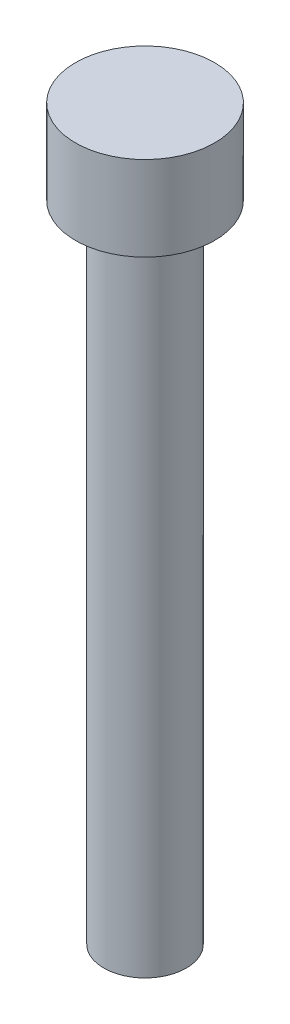
ISO-10303-21;
HEADER;
FILE_DESCRIPTION(('STEP AP214'),'2;1');
FILE_NAME('part.step','',(''),(''),'','','');
FILE_SCHEMA(('AUTOMOTIVE_DESIGN { 1 0 10303 214 1 1 1 1 }'));
ENDSEC;
DATA;
#1=APPLICATION_CONTEXT('core data for automotive mechanical design processes');
#2=APPLICATION_PROTOCOL_DEFINITION('international standard','automotive_design',2000,#1);
#3=PRODUCT_CONTEXT('',#1,'mechanical');
#4=PRODUCT('Part','Part','',(#3));
#5=PRODUCT_RELATED_PRODUCT_CATEGORY('part','',(#4));
#6=PRODUCT_DEFINITION_FORMATION('','',#4);
#7=PRODUCT_DEFINITION_CONTEXT('part definition',#1,'design');
#8=PRODUCT_DEFINITION('design','',#6,#7);
#9=PRODUCT_DEFINITION_SHAPE('','',#8);
#10=(LENGTH_UNIT() NAMED_UNIT(*) SI_UNIT(.MILLI.,.METRE.));
#11=(NAMED_UNIT(*) PLANE_ANGLE_UNIT() SI_UNIT($,.RADIAN.));
#12=(NAMED_UNIT(*) SI_UNIT($,.STERADIAN.) SOLID_ANGLE_UNIT());
#13=UNCERTAINTY_MEASURE_WITH_UNIT(LENGTH_MEASURE(1.E-05),#10,'distance_accuracy_value','');
#14=(GEOMETRIC_REPRESENTATION_CONTEXT(3) GLOBAL_UNCERTAINTY_ASSIGNED_CONTEXT((#13)) GLOBAL_UNIT_ASSIGNED_CONTEXT((#10,
#11,#12)) REPRESENTATION_CONTEXT('',''));
#15=CARTESIAN_POINT('',(0.,0.,0.));
#16=DIRECTION('',(0.,0.,1.));
#17=DIRECTION('',(1.,0.,0.));
#18=AXIS2_PLACEMENT_3D('',#15,#16,#17);
#19=CARTESIAN_POINT('',(2.032,0.,0.));
#20=DIRECTION('',(0.,-1.,0.));
#21=DIRECTION('',(0.,0.,-1.));
#22=AXIS2_PLACEMENT_3D('',#19,#20,#21);
#23=PLANE('',#22);
#24=CARTESIAN_POINT('',(0.,0.,0.));
#25=DIRECTION('',(0.,-1.,0.));
#26=DIRECTION('',(0.,0.,-1.));
#27=AXIS2_PLACEMENT_3D('',#24,#25,#26);
#28=CIRCLE('',#27,2.032);
#29=CARTESIAN_POINT('',(0.,0.,-2.032));
#30=VERTEX_POINT('',#29);
#31=EDGE_CURVE('E51',#30,#30,#28,.T.);
#32=ORIENTED_EDGE('',*,*,#31,.T.);
#33=EDGE_LOOP('',(#32));
#34=FACE_BOUND('',#33,.T.);
#35=ADVANCED_FACE('F37',(#34),#23,.T.);
#36=CARTESIAN_POINT('',(0.,35.9156,0.));
#37=DIRECTION('',(0.,1.,0.));
#38=DIRECTION('',(0.,0.,1.));
#39=AXIS2_PLACEMENT_3D('',#36,#37,#38);
#40=PLANE('',#39);
#41=CARTESIAN_POINT('',(0.,35.9156,0.));
#42=DIRECTION('',(0.,-1.,0.));
#43=DIRECTION('',(0.,0.,-1.));
#44=AXIS2_PLACEMENT_3D('',#41,#42,#43);
#45=CIRCLE('',#44,3.429);
#46=CARTESIAN_POINT('',(0.,35.9156,-3.429));
#47=VERTEX_POINT('',#46);
#48=EDGE_CURVE('E10',#47,#47,#45,.T.);
#49=ORIENTED_EDGE('',*,*,#48,.F.);
#50=EDGE_LOOP('',(#49));
#51=FACE_BOUND('',#50,.T.);
#52=ADVANCED_FACE('F69',(#51),#40,.T.);
#53=CARTESIAN_POINT('',(0.,0.,0.));
#54=DIRECTION('',(0.,-1.,0.));
#55=DIRECTION('',(0.,0.,-1.));
#56=AXIS2_PLACEMENT_3D('',#53,#54,#55);
#57=CYLINDRICAL_SURFACE('',#56,3.429);
#58=ORIENTED_EDGE('',*,*,#48,.T.);
#59=EDGE_LOOP('',(#58));
#60=FACE_BOUND('',#59,.T.);
#61=CARTESIAN_POINT('',(0.,31.75,0.));
#62=DIRECTION('',(0.,-1.,0.));
#63=DIRECTION('',(0.,0.,-1.));
#64=AXIS2_PLACEMENT_3D('',#61,#62,#63);
#65=CIRCLE('',#64,3.429);
#66=CARTESIAN_POINT('',(0.,31.75,-3.429));
#67=VERTEX_POINT('',#66);
#68=EDGE_CURVE('E43',#67,#67,#65,.T.);
#69=ORIENTED_EDGE('',*,*,#68,.F.);
#70=EDGE_LOOP('',(#69));
#71=FACE_BOUND('',#70,.T.);
#72=ADVANCED_FACE('F66',(#60,#71),#57,.T.);
#73=CARTESIAN_POINT('',(3.429,31.75,0.));
#74=DIRECTION('',(0.,-1.,0.));
#75=DIRECTION('',(0.,0.,-1.));
#76=AXIS2_PLACEMENT_3D('',#73,#74,#75);
#77=PLANE('',#76);
#78=ORIENTED_EDGE('',*,*,#68,.T.);
#79=EDGE_LOOP('',(#78));
#80=FACE_BOUND('',#79,.T.);
#81=CARTESIAN_POINT('',(0.,31.75,0.));
#82=DIRECTION('',(0.,-1.,0.));
#83=DIRECTION('',(0.,0.,-1.));
#84=AXIS2_PLACEMENT_3D('',#81,#82,#83);
#85=CIRCLE('',#84,2.032);
#86=CARTESIAN_POINT('',(0.,31.75,-2.032));
#87=VERTEX_POINT('',#86);
#88=EDGE_CURVE('E47',#87,#87,#85,.T.);
#89=ORIENTED_EDGE('',*,*,#88,.F.);
#90=EDGE_LOOP('',(#89));
#91=FACE_BOUND('',#90,.T.);
#92=ADVANCED_FACE('F60',(#80,#91),#77,.T.);
#93=CARTESIAN_POINT('',(0.,0.,0.));
#94=DIRECTION('',(0.,-1.,0.));
#95=DIRECTION('',(0.,0.,-1.));
#96=AXIS2_PLACEMENT_3D('',#93,#94,#95);
#97=CYLINDRICAL_SURFACE('',#96,2.032);
#98=ORIENTED_EDGE('',*,*,#88,.T.);
#99=EDGE_LOOP('',(#98));
#100=FACE_BOUND('',#99,.T.);
#101=ORIENTED_EDGE('',*,*,#31,.F.);
#102=EDGE_LOOP('',(#101));
#103=FACE_BOUND('',#102,.T.);
#104=ADVANCED_FACE('F58',(#100,#103),#97,.T.);
#105=CLOSED_SHELL('',(#35,#52,#72,#92,#104));
#106=MANIFOLD_SOLID_BREP('B2',#105);
#107=ADVANCED_BREP_SHAPE_REPRESENTATION('',(#18,#106),#14);
#108=SHAPE_DEFINITION_REPRESENTATION(#9,#107);
ENDSEC;
END-ISO-10303-21;
